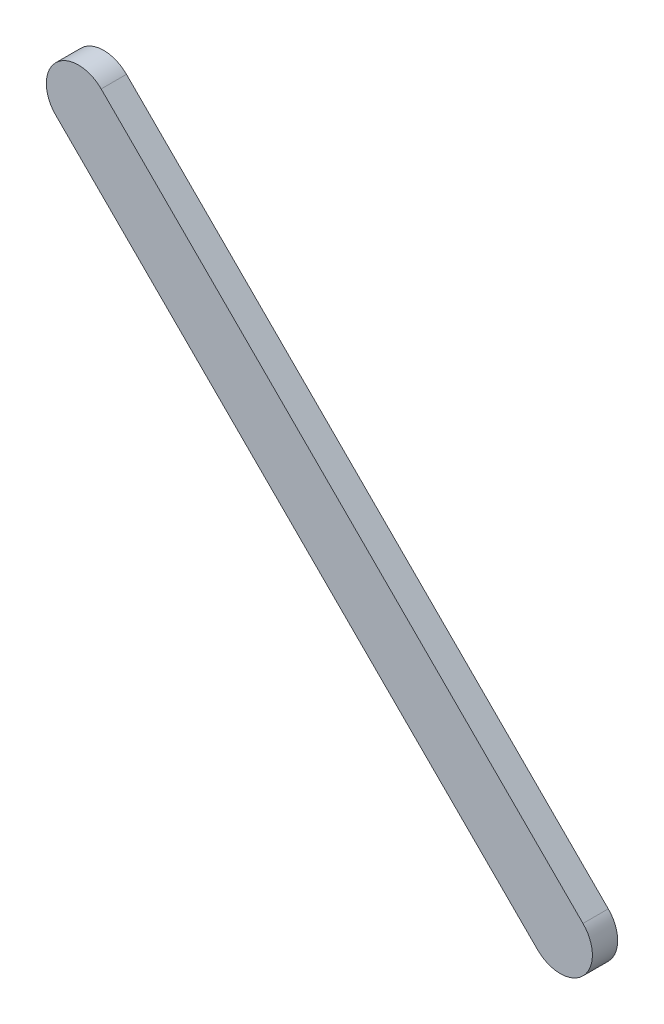
ISO-10303-21;
HEADER;
FILE_DESCRIPTION(('STEP AP214'),'2;1');
FILE_NAME('part.step','',(''),(''),'','','');
FILE_SCHEMA(('AUTOMOTIVE_DESIGN { 1 0 10303 214 1 1 1 1 }'));
ENDSEC;
DATA;
#1=APPLICATION_CONTEXT('core data for automotive mechanical design processes');
#2=APPLICATION_PROTOCOL_DEFINITION('international standard','automotive_design',2000,#1);
#3=PRODUCT_CONTEXT('',#1,'mechanical');
#4=PRODUCT('Part','Part','',(#3));
#5=PRODUCT_RELATED_PRODUCT_CATEGORY('part','',(#4));
#6=PRODUCT_DEFINITION_FORMATION('','',#4);
#7=PRODUCT_DEFINITION_CONTEXT('part definition',#1,'design');
#8=PRODUCT_DEFINITION('design','',#6,#7);
#9=PRODUCT_DEFINITION_SHAPE('','',#8);
#10=(LENGTH_UNIT() NAMED_UNIT(*) SI_UNIT(.MILLI.,.METRE.));
#11=(NAMED_UNIT(*) PLANE_ANGLE_UNIT() SI_UNIT($,.RADIAN.));
#12=(NAMED_UNIT(*) SI_UNIT($,.STERADIAN.) SOLID_ANGLE_UNIT());
#13=UNCERTAINTY_MEASURE_WITH_UNIT(LENGTH_MEASURE(1.E-05),#10,'distance_accuracy_value','');
#14=(GEOMETRIC_REPRESENTATION_CONTEXT(3) GLOBAL_UNCERTAINTY_ASSIGNED_CONTEXT((#13)) GLOBAL_UNIT_ASSIGNED_CONTEXT((#10,
#11,#12)) REPRESENTATION_CONTEXT('',''));
#15=CARTESIAN_POINT('',(0.,0.,0.));
#16=DIRECTION('',(0.,0.,1.));
#17=DIRECTION('',(1.,0.,0.));
#18=AXIS2_PLACEMENT_3D('',#15,#16,#17);
#19=CARTESIAN_POINT('',(151.45839406,122.62939406,0.));
#20=DIRECTION('',(0.707106781186548,0.707106781186548,0.));
#21=DIRECTION('',(0.707106781186548,-0.707106781186548,0.));
#22=AXIS2_PLACEMENT_3D('',#19,#20,#21);
#23=PLANE('',#22);
#24=DIRECTION('',(0.707106781186548,-0.707106781186548,0.));
#25=VECTOR('',#24,1.);
#26=CARTESIAN_POINT('',(151.45839406,122.62939406,0.1999996));
#27=LINE('',#26,#25);
#28=CARTESIAN_POINT('',(151.45839406,122.62939406,0.1999996));
#29=VERTEX_POINT('',#28);
#30=CARTESIAN_POINT('',(155.26839406,118.81939406,0.1999996));
#31=VERTEX_POINT('',#30);
#32=EDGE_CURVE('E11',#29,#31,#27,.T.);
#33=ORIENTED_EDGE('',*,*,#32,.F.);
#34=DIRECTION('',(0.,0.,1.));
#35=VECTOR('',#34,1.);
#36=CARTESIAN_POINT('',(151.45839406,122.62939406,0.));
#37=LINE('',#36,#35);
#38=CARTESIAN_POINT('',(151.45839406,122.62939406,0.));
#39=VERTEX_POINT('',#38);
#40=EDGE_CURVE('E24',#39,#29,#37,.T.);
#41=ORIENTED_EDGE('',*,*,#40,.F.);
#42=DIRECTION('',(0.707106781186548,-0.707106781186548,0.));
#43=VECTOR('',#42,1.);
#44=CARTESIAN_POINT('',(151.45839406,122.62939406,0.));
#45=LINE('',#44,#43);
#46=CARTESIAN_POINT('',(155.26839406,118.81939406,0.));
#47=VERTEX_POINT('',#46);
#48=EDGE_CURVE('E75',#39,#47,#45,.T.);
#49=ORIENTED_EDGE('',*,*,#48,.T.);
#50=DIRECTION('',(0.,0.,1.));
#51=VECTOR('',#50,1.);
#52=CARTESIAN_POINT('',(155.26839406,118.81939406,0.));
#53=LINE('',#52,#51);
#54=EDGE_CURVE('E37',#47,#31,#53,.T.);
#55=ORIENTED_EDGE('',*,*,#54,.T.);
#56=EDGE_LOOP('',(#33,#41,#49,#55));
#57=FACE_BOUND('',#56,.T.);
#58=ADVANCED_FACE('F17',(#57),#23,.F.);
#59=CARTESIAN_POINT('',(155.448,118.999,0.));
#60=DIRECTION('',(0.,0.,-1.));
#61=DIRECTION('',(-0.707106781186492,-0.707106781186604,0.));
#62=AXIS2_PLACEMENT_3D('',#59,#60,#61);
#63=CYLINDRICAL_SURFACE('',#62,0.254001156230781);
#64=CARTESIAN_POINT('',(155.448,118.999,0.1999996));
#65=DIRECTION('',(0.,0.,1.));
#66=DIRECTION('',(-0.707106781186492,-0.707106781186604,0.));
#67=AXIS2_PLACEMENT_3D('',#64,#65,#66);
#68=CIRCLE('',#67,0.254001156230781);
#69=CARTESIAN_POINT('',(155.62760594,119.17860594,0.1999996));
#70=VERTEX_POINT('',#69);
#71=EDGE_CURVE('E83',#31,#70,#68,.T.);
#72=ORIENTED_EDGE('',*,*,#71,.F.);
#73=ORIENTED_EDGE('',*,*,#54,.F.);
#74=CARTESIAN_POINT('',(155.448,118.999,0.));
#75=DIRECTION('',(0.,0.,1.));
#76=DIRECTION('',(-0.707106781186492,-0.707106781186604,0.));
#77=AXIS2_PLACEMENT_3D('',#74,#75,#76);
#78=CIRCLE('',#77,0.254001156230781);
#79=CARTESIAN_POINT('',(155.62760594,119.17860594,0.));
#80=VERTEX_POINT('',#79);
#81=EDGE_CURVE('E81',#47,#80,#78,.T.);
#82=ORIENTED_EDGE('',*,*,#81,.T.);
#83=DIRECTION('',(0.,0.,1.));
#84=VECTOR('',#83,1.);
#85=CARTESIAN_POINT('',(155.62760594,119.17860594,0.));
#86=LINE('',#85,#84);
#87=EDGE_CURVE('E67',#80,#70,#86,.T.);
#88=ORIENTED_EDGE('',*,*,#87,.T.);
#89=EDGE_LOOP('',(#72,#73,#82,#88));
#90=FACE_BOUND('',#89,.T.);
#91=ADVANCED_FACE('F89',(#90),#63,.T.);
#92=CARTESIAN_POINT('',(155.62760594,119.17860594,0.));
#93=DIRECTION('',(-0.707106781186546,-0.707106781186549,0.));
#94=DIRECTION('',(-0.707106781186549,0.707106781186546,0.));
#95=AXIS2_PLACEMENT_3D('',#92,#93,#94);
#96=PLANE('',#95);
#97=DIRECTION('',(-0.707106781186549,0.707106781186546,0.));
#98=VECTOR('',#97,1.);
#99=CARTESIAN_POINT('',(155.62760594,119.17860594,0.1999996));
#100=LINE('',#99,#98);
#101=CARTESIAN_POINT('',(151.81760594,122.98860594,0.1999996));
#102=VERTEX_POINT('',#101);
#103=EDGE_CURVE('E71',#70,#102,#100,.T.);
#104=ORIENTED_EDGE('',*,*,#103,.F.);
#105=ORIENTED_EDGE('',*,*,#87,.F.);
#106=DIRECTION('',(-0.707106781186549,0.707106781186546,0.));
#107=VECTOR('',#106,1.);
#108=CARTESIAN_POINT('',(155.62760594,119.17860594,0.));
#109=LINE('',#108,#107);
#110=CARTESIAN_POINT('',(151.81760594,122.98860594,0.));
#111=VERTEX_POINT('',#110);
#112=EDGE_CURVE('E63',#80,#111,#109,.T.);
#113=ORIENTED_EDGE('',*,*,#112,.T.);
#114=DIRECTION('',(0.,0.,1.));
#115=VECTOR('',#114,1.);
#116=CARTESIAN_POINT('',(151.81760594,122.98860594,0.));
#117=LINE('',#116,#115);
#118=EDGE_CURVE('E53',#111,#102,#117,.T.);
#119=ORIENTED_EDGE('',*,*,#118,.T.);
#120=EDGE_LOOP('',(#104,#105,#113,#119));
#121=FACE_BOUND('',#120,.T.);
#122=ADVANCED_FACE('F66',(#121),#96,.F.);
#123=CARTESIAN_POINT('',(151.638,122.809,0.));
#124=DIRECTION('',(0.,0.,-1.));
#125=DIRECTION('',(0.707106781186576,0.70710678118652,0.));
#126=AXIS2_PLACEMENT_3D('',#123,#124,#125);
#127=CYLINDRICAL_SURFACE('',#126,0.254001156230768);
#128=CARTESIAN_POINT('',(151.638,122.809,0.1999996));
#129=DIRECTION('',(0.,0.,1.));
#130=DIRECTION('',(0.707106781186576,0.70710678118652,0.));
#131=AXIS2_PLACEMENT_3D('',#128,#129,#130);
#132=CIRCLE('',#131,0.254001156230768);
#133=EDGE_CURVE('E59',#102,#29,#132,.T.);
#134=ORIENTED_EDGE('',*,*,#133,.F.);
#135=ORIENTED_EDGE('',*,*,#118,.F.);
#136=CARTESIAN_POINT('',(151.638,122.809,0.));
#137=DIRECTION('',(0.,0.,1.));
#138=DIRECTION('',(0.707106781186576,0.70710678118652,0.));
#139=AXIS2_PLACEMENT_3D('',#136,#137,#138);
#140=CIRCLE('',#139,0.254001156230768);
#141=EDGE_CURVE('E57',#111,#39,#140,.T.);
#142=ORIENTED_EDGE('',*,*,#141,.T.);
#143=ORIENTED_EDGE('',*,*,#40,.T.);
#144=EDGE_LOOP('',(#134,#135,#142,#143));
#145=FACE_BOUND('',#144,.T.);
#146=ADVANCED_FACE('F55',(#145),#127,.T.);
#147=CARTESIAN_POINT('',(151.45839406,122.62939406,0.));
#148=DIRECTION('',(0.,0.,-1.));
#149=DIRECTION('',(-1.,0.,0.));
#150=AXIS2_PLACEMENT_3D('',#147,#148,#149);
#151=PLANE('',#150);
#152=ORIENTED_EDGE('',*,*,#141,.F.);
#153=ORIENTED_EDGE('',*,*,#112,.F.);
#154=ORIENTED_EDGE('',*,*,#81,.F.);
#155=ORIENTED_EDGE('',*,*,#48,.F.);
#156=EDGE_LOOP('',(#152,#153,#154,#155));
#157=FACE_BOUND('',#156,.T.);
#158=ADVANCED_FACE('F74',(#157),#151,.T.);
#159=CARTESIAN_POINT('',(151.45839406,122.62939406,0.1999996));
#160=DIRECTION('',(0.,0.,-1.));
#161=DIRECTION('',(-1.,0.,0.));
#162=AXIS2_PLACEMENT_3D('',#159,#160,#161);
#163=PLANE('',#162);
#164=ORIENTED_EDGE('',*,*,#32,.T.);
#165=ORIENTED_EDGE('',*,*,#71,.T.);
#166=ORIENTED_EDGE('',*,*,#103,.T.);
#167=ORIENTED_EDGE('',*,*,#133,.T.);
#168=EDGE_LOOP('',(#164,#165,#166,#167));
#169=FACE_BOUND('',#168,.T.);
#170=ADVANCED_FACE('F91',(#169),#163,.F.);
#171=CLOSED_SHELL('',(#58,#91,#122,#146,#158,#170));
#172=MANIFOLD_SOLID_BREP('B1',#171);
#173=ADVANCED_BREP_SHAPE_REPRESENTATION('',(#18,#172),#14);
#174=SHAPE_DEFINITION_REPRESENTATION(#9,#173);
ENDSEC;
END-ISO-10303-21;
